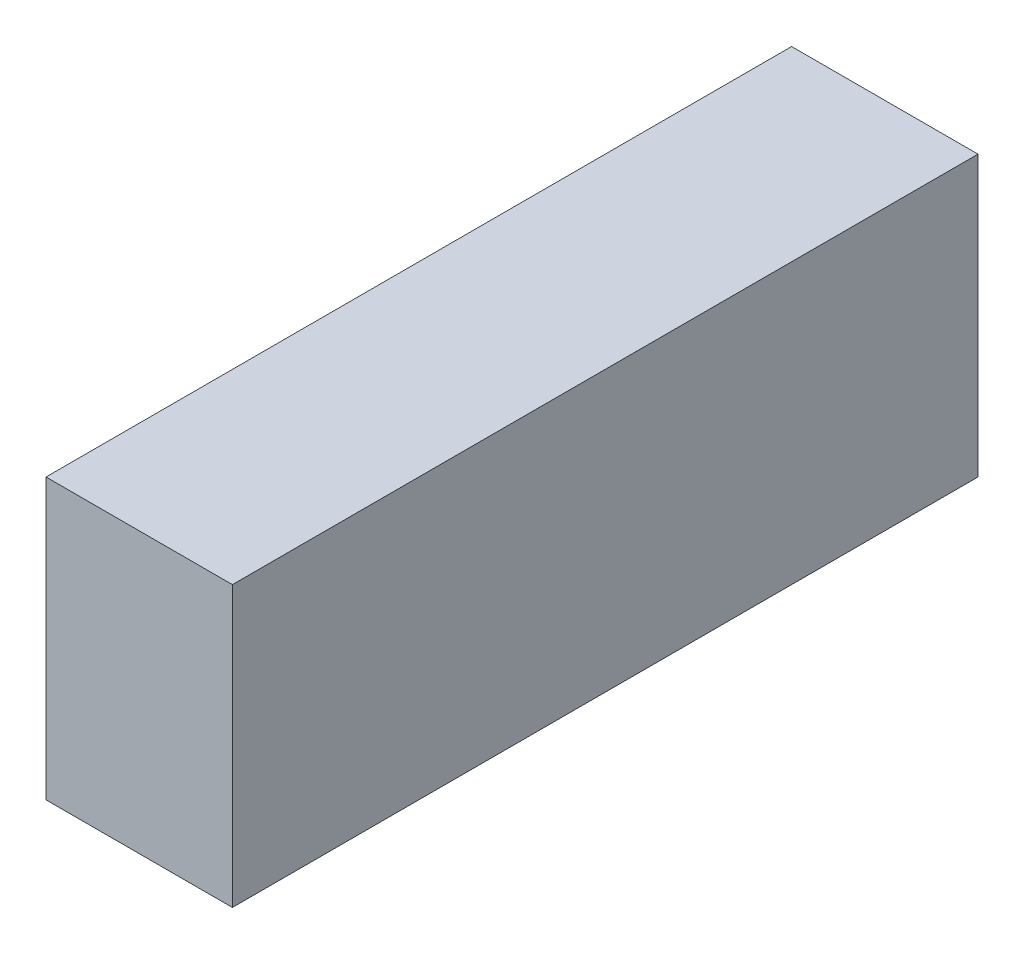
ISO-10303-21;
HEADER;
FILE_DESCRIPTION(('STEP AP214'),'2;1');
FILE_NAME('part.step','',(''),(''),'','','');
FILE_SCHEMA(('AUTOMOTIVE_DESIGN { 1 0 10303 214 1 1 1 1 }'));
ENDSEC;
DATA;
#1=APPLICATION_CONTEXT('core data for automotive mechanical design processes');
#2=APPLICATION_PROTOCOL_DEFINITION('international standard','automotive_design',2000,#1);
#3=PRODUCT_CONTEXT('',#1,'mechanical');
#4=PRODUCT('Part','Part','',(#3));
#5=PRODUCT_RELATED_PRODUCT_CATEGORY('part','',(#4));
#6=PRODUCT_DEFINITION_FORMATION('','',#4);
#7=PRODUCT_DEFINITION_CONTEXT('part definition',#1,'design');
#8=PRODUCT_DEFINITION('design','',#6,#7);
#9=PRODUCT_DEFINITION_SHAPE('','',#8);
#10=(LENGTH_UNIT() NAMED_UNIT(*) SI_UNIT(.MILLI.,.METRE.));
#11=(NAMED_UNIT(*) PLANE_ANGLE_UNIT() SI_UNIT($,.RADIAN.));
#12=(NAMED_UNIT(*) SI_UNIT($,.STERADIAN.) SOLID_ANGLE_UNIT());
#13=UNCERTAINTY_MEASURE_WITH_UNIT(LENGTH_MEASURE(1.E-05),#10,'distance_accuracy_value','');
#14=(GEOMETRIC_REPRESENTATION_CONTEXT(3) GLOBAL_UNCERTAINTY_ASSIGNED_CONTEXT((#13)) GLOBAL_UNIT_ASSIGNED_CONTEXT((#10,
#11,#12)) REPRESENTATION_CONTEXT('',''));
#15=CARTESIAN_POINT('',(0.,0.,0.));
#16=DIRECTION('',(0.,0.,1.));
#17=DIRECTION('',(1.,0.,0.));
#18=AXIS2_PLACEMENT_3D('',#15,#16,#17);
#19=CARTESIAN_POINT('',(2.,29.,-80.));
#20=DIRECTION('',(-1.,0.,0.));
#21=DIRECTION('',(0.,0.,1.));
#22=AXIS2_PLACEMENT_3D('',#19,#20,#21);
#23=PLANE('',#22);
#24=DIRECTION('',(0.,-1.,0.));
#25=VECTOR('',#24,1.);
#26=CARTESIAN_POINT('',(2.,29.,-40.));
#27=LINE('',#26,#25);
#28=CARTESIAN_POINT('',(2.,44.,-40.));
#29=VERTEX_POINT('',#28);
#30=CARTESIAN_POINT('',(2.,29.,-40.));
#31=VERTEX_POINT('',#30);
#32=EDGE_CURVE('E103',#29,#31,#27,.T.);
#33=ORIENTED_EDGE('',*,*,#32,.F.);
#34=DIRECTION('',(0.,0.,1.));
#35=VECTOR('',#34,1.);
#36=CARTESIAN_POINT('',(2.,44.,-80.));
#37=LINE('',#36,#35);
#38=CARTESIAN_POINT('',(2.,44.,-80.));
#39=VERTEX_POINT('',#38);
#40=EDGE_CURVE('E11',#39,#29,#37,.T.);
#41=ORIENTED_EDGE('',*,*,#40,.F.);
#42=DIRECTION('',(0.,-1.,0.));
#43=VECTOR('',#42,1.);
#44=CARTESIAN_POINT('',(2.,29.,-80.));
#45=LINE('',#44,#43);
#46=CARTESIAN_POINT('',(2.,29.,-80.));
#47=VERTEX_POINT('',#46);
#48=EDGE_CURVE('E97',#39,#47,#45,.T.);
#49=ORIENTED_EDGE('',*,*,#48,.T.);
#50=DIRECTION('',(0.,0.,1.));
#51=VECTOR('',#50,1.);
#52=CARTESIAN_POINT('',(2.,29.,-80.));
#53=LINE('',#52,#51);
#54=EDGE_CURVE('E42',#47,#31,#53,.T.);
#55=ORIENTED_EDGE('',*,*,#54,.T.);
#56=EDGE_LOOP('',(#33,#41,#49,#55));
#57=FACE_BOUND('',#56,.T.);
#58=ADVANCED_FACE('F39',(#57),#23,.T.);
#59=CARTESIAN_POINT('',(2.,44.,-80.));
#60=DIRECTION('',(0.,1.,0.));
#61=DIRECTION('',(0.,0.,1.));
#62=AXIS2_PLACEMENT_3D('',#59,#60,#61);
#63=PLANE('',#62);
#64=DIRECTION('',(-1.,0.,0.));
#65=VECTOR('',#64,1.);
#66=CARTESIAN_POINT('',(2.,44.,-40.));
#67=LINE('',#66,#65);
#68=CARTESIAN_POINT('',(12.,44.,-40.));
#69=VERTEX_POINT('',#68);
#70=EDGE_CURVE('E99',#69,#29,#67,.T.);
#71=ORIENTED_EDGE('',*,*,#70,.F.);
#72=DIRECTION('',(0.,0.,1.));
#73=VECTOR('',#72,1.);
#74=CARTESIAN_POINT('',(12.,44.,-80.));
#75=LINE('',#74,#73);
#76=CARTESIAN_POINT('',(12.,44.,-80.));
#77=VERTEX_POINT('',#76);
#78=EDGE_CURVE('E48',#77,#69,#75,.T.);
#79=ORIENTED_EDGE('',*,*,#78,.F.);
#80=DIRECTION('',(-1.,0.,0.));
#81=VECTOR('',#80,1.);
#82=CARTESIAN_POINT('',(2.,44.,-80.));
#83=LINE('',#82,#81);
#84=EDGE_CURVE('E94',#77,#39,#83,.T.);
#85=ORIENTED_EDGE('',*,*,#84,.T.);
#86=ORIENTED_EDGE('',*,*,#40,.T.);
#87=EDGE_LOOP('',(#71,#79,#85,#86));
#88=FACE_BOUND('',#87,.T.);
#89=ADVANCED_FACE('F113',(#88),#63,.T.);
#90=CARTESIAN_POINT('',(12.,29.,-80.));
#91=DIRECTION('',(1.,0.,0.));
#92=DIRECTION('',(0.,0.,-1.));
#93=AXIS2_PLACEMENT_3D('',#90,#91,#92);
#94=PLANE('',#93);
#95=DIRECTION('',(0.,1.,0.));
#96=VECTOR('',#95,1.);
#97=CARTESIAN_POINT('',(12.,29.,-40.));
#98=LINE('',#97,#96);
#99=CARTESIAN_POINT('',(12.,29.,-40.));
#100=VERTEX_POINT('',#99);
#101=EDGE_CURVE('E89',#100,#69,#98,.T.);
#102=ORIENTED_EDGE('',*,*,#101,.F.);
#103=DIRECTION('',(0.,0.,1.));
#104=VECTOR('',#103,1.);
#105=CARTESIAN_POINT('',(12.,29.,-80.));
#106=LINE('',#105,#104);
#107=CARTESIAN_POINT('',(12.,29.,-80.));
#108=VERTEX_POINT('',#107);
#109=EDGE_CURVE('E84',#108,#100,#106,.T.);
#110=ORIENTED_EDGE('',*,*,#109,.F.);
#111=DIRECTION('',(0.,1.,0.));
#112=VECTOR('',#111,1.);
#113=CARTESIAN_POINT('',(12.,29.,-80.));
#114=LINE('',#113,#112);
#115=EDGE_CURVE('E87',#108,#77,#114,.T.);
#116=ORIENTED_EDGE('',*,*,#115,.T.);
#117=ORIENTED_EDGE('',*,*,#78,.T.);
#118=EDGE_LOOP('',(#102,#110,#116,#117));
#119=FACE_BOUND('',#118,.T.);
#120=ADVANCED_FACE('F86',(#119),#94,.T.);
#121=CARTESIAN_POINT('',(2.,29.,-80.));
#122=DIRECTION('',(0.,-1.,0.));
#123=DIRECTION('',(0.,0.,-1.));
#124=AXIS2_PLACEMENT_3D('',#121,#122,#123);
#125=PLANE('',#124);
#126=DIRECTION('',(1.,0.,0.));
#127=VECTOR('',#126,1.);
#128=CARTESIAN_POINT('',(2.,29.,-40.));
#129=LINE('',#128,#127);
#130=EDGE_CURVE('E106',#31,#100,#129,.T.);
#131=ORIENTED_EDGE('',*,*,#130,.F.);
#132=ORIENTED_EDGE('',*,*,#54,.F.);
#133=DIRECTION('',(1.,0.,0.));
#134=VECTOR('',#133,1.);
#135=CARTESIAN_POINT('',(2.,29.,-80.));
#136=LINE('',#135,#134);
#137=EDGE_CURVE('E93',#47,#108,#136,.T.);
#138=ORIENTED_EDGE('',*,*,#137,.T.);
#139=ORIENTED_EDGE('',*,*,#109,.T.);
#140=EDGE_LOOP('',(#131,#132,#138,#139));
#141=FACE_BOUND('',#140,.T.);
#142=ADVANCED_FACE('F96',(#141),#125,.T.);
#143=CARTESIAN_POINT('',(0.,0.,-80.));
#144=DIRECTION('',(0.,0.,-1.));
#145=DIRECTION('',(-1.,0.,0.));
#146=AXIS2_PLACEMENT_3D('',#143,#144,#145);
#147=PLANE('',#146);
#148=ORIENTED_EDGE('',*,*,#48,.F.);
#149=ORIENTED_EDGE('',*,*,#84,.F.);
#150=ORIENTED_EDGE('',*,*,#115,.F.);
#151=ORIENTED_EDGE('',*,*,#137,.F.);
#152=EDGE_LOOP('',(#148,#149,#150,#151));
#153=FACE_BOUND('',#152,.T.);
#154=ADVANCED_FACE('F92',(#153),#147,.T.);
#155=CARTESIAN_POINT('',(0.,0.,-40.));
#156=DIRECTION('',(0.,0.,-1.));
#157=DIRECTION('',(-1.,0.,0.));
#158=AXIS2_PLACEMENT_3D('',#155,#156,#157);
#159=PLANE('',#158);
#160=ORIENTED_EDGE('',*,*,#32,.T.);
#161=ORIENTED_EDGE('',*,*,#130,.T.);
#162=ORIENTED_EDGE('',*,*,#101,.T.);
#163=ORIENTED_EDGE('',*,*,#70,.T.);
#164=EDGE_LOOP('',(#160,#161,#162,#163));
#165=FACE_BOUND('',#164,.T.);
#166=ADVANCED_FACE('F112',(#165),#159,.F.);
#167=CLOSED_SHELL('',(#58,#89,#120,#142,#154,#166));
#168=MANIFOLD_SOLID_BREP('B2',#167);
#169=ADVANCED_BREP_SHAPE_REPRESENTATION('',(#18,#168),#14);
#170=SHAPE_DEFINITION_REPRESENTATION(#9,#169);
ENDSEC;
END-ISO-10303-21;
